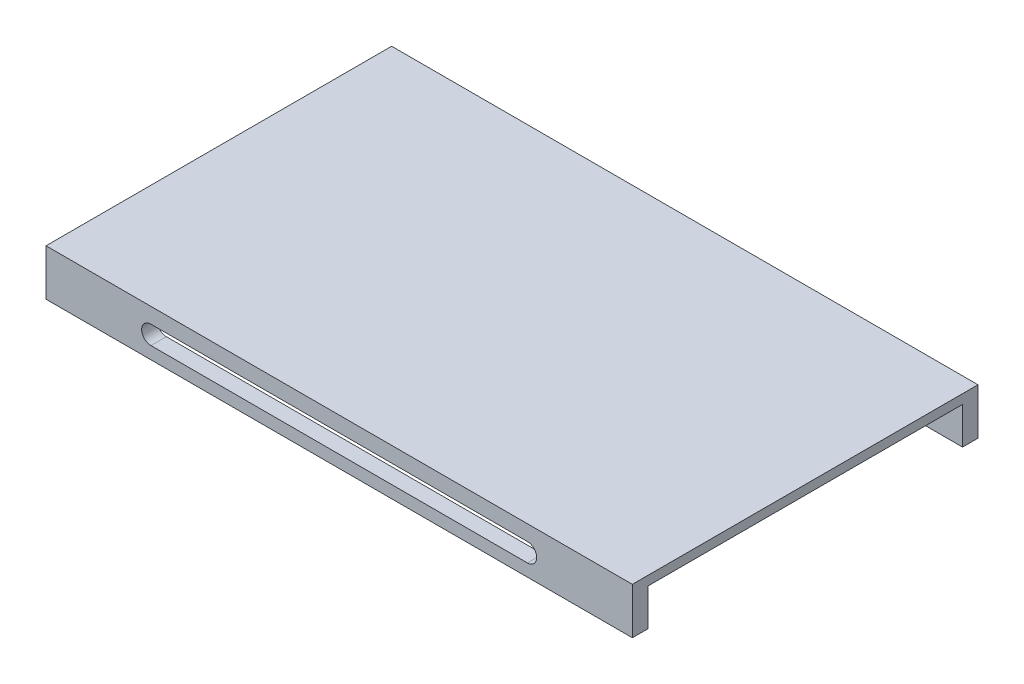
ISO-10303-21;
HEADER;
FILE_DESCRIPTION(('STEP AP214'),'2;1');
FILE_NAME('part.step','',(''),(''),'','','');
FILE_SCHEMA(('AUTOMOTIVE_DESIGN { 1 0 10303 214 1 1 1 1 }'));
ENDSEC;
DATA;
#1=APPLICATION_CONTEXT('core data for automotive mechanical design processes');
#2=APPLICATION_PROTOCOL_DEFINITION('international standard','automotive_design',2000,#1);
#3=PRODUCT_CONTEXT('',#1,'mechanical');
#4=PRODUCT('Part','Part','',(#3));
#5=PRODUCT_RELATED_PRODUCT_CATEGORY('part','',(#4));
#6=PRODUCT_DEFINITION_FORMATION('','',#4);
#7=PRODUCT_DEFINITION_CONTEXT('part definition',#1,'design');
#8=PRODUCT_DEFINITION('design','',#6,#7);
#9=PRODUCT_DEFINITION_SHAPE('','',#8);
#10=(LENGTH_UNIT() NAMED_UNIT(*) SI_UNIT(.MILLI.,.METRE.));
#11=(NAMED_UNIT(*) PLANE_ANGLE_UNIT() SI_UNIT($,.RADIAN.));
#12=(NAMED_UNIT(*) SI_UNIT($,.STERADIAN.) SOLID_ANGLE_UNIT());
#13=UNCERTAINTY_MEASURE_WITH_UNIT(LENGTH_MEASURE(1.E-05),#10,'distance_accuracy_value','');
#14=(GEOMETRIC_REPRESENTATION_CONTEXT(3) GLOBAL_UNCERTAINTY_ASSIGNED_CONTEXT((#13)) GLOBAL_UNIT_ASSIGNED_CONTEXT((#10,
#11,#12)) REPRESENTATION_CONTEXT('',''));
#15=CARTESIAN_POINT('',(0.,0.,0.));
#16=DIRECTION('',(0.,0.,1.));
#17=DIRECTION('',(1.,0.,0.));
#18=AXIS2_PLACEMENT_3D('',#15,#16,#17);
#19=CARTESIAN_POINT('',(0.,0.,0.));
#20=DIRECTION('',(0.,1.,0.));
#21=DIRECTION('',(0.,0.,1.));
#22=AXIS2_PLACEMENT_3D('',#19,#20,#21);
#23=PLANE('',#22);
#24=DIRECTION('',(0.,0.,1.));
#25=VECTOR('',#24,1.);
#26=CARTESIAN_POINT('',(0.,0.,0.));
#27=LINE('',#26,#25);
#28=CARTESIAN_POINT('',(0.,0.,107.));
#29=VERTEX_POINT('',#28);
#30=CARTESIAN_POINT('',(0.,0.,112.));
#31=VERTEX_POINT('',#30);
#32=EDGE_CURVE('E171',#29,#31,#27,.T.);
#33=ORIENTED_EDGE('',*,*,#32,.F.);
#34=DIRECTION('',(1.,0.,0.));
#35=VECTOR('',#34,1.);
#36=CARTESIAN_POINT('',(0.,0.,107.));
#37=LINE('',#36,#35);
#38=CARTESIAN_POINT('',(190.,0.,107.));
#39=VERTEX_POINT('',#38);
#40=EDGE_CURVE('E162',#29,#39,#37,.T.);
#41=ORIENTED_EDGE('',*,*,#40,.T.);
#42=DIRECTION('',(0.,0.,-1.));
#43=VECTOR('',#42,1.);
#44=CARTESIAN_POINT('',(190.,0.,112.));
#45=LINE('',#44,#43);
#46=CARTESIAN_POINT('',(190.,0.,112.));
#47=VERTEX_POINT('',#46);
#48=EDGE_CURVE('E195',#47,#39,#45,.T.);
#49=ORIENTED_EDGE('',*,*,#48,.F.);
#50=DIRECTION('',(1.,0.,0.));
#51=VECTOR('',#50,1.);
#52=CARTESIAN_POINT('',(0.,0.,112.));
#53=LINE('',#52,#51);
#54=EDGE_CURVE('E192',#31,#47,#53,.T.);
#55=ORIENTED_EDGE('',*,*,#54,.F.);
#56=EDGE_LOOP('',(#33,#41,#49,#55));
#57=FACE_BOUND('',#56,.T.);
#58=ADVANCED_FACE('F33',(#57),#23,.F.);
#59=CARTESIAN_POINT('',(0.,15.,0.));
#60=DIRECTION('',(1.,0.,0.));
#61=DIRECTION('',(0.,0.,-1.));
#62=AXIS2_PLACEMENT_3D('',#59,#60,#61);
#63=PLANE('',#62);
#64=DIRECTION('',(0.,0.,1.));
#65=VECTOR('',#64,1.);
#66=CARTESIAN_POINT('',(0.,12.,107.));
#67=LINE('',#66,#65);
#68=CARTESIAN_POINT('',(0.,12.,5.));
#69=VERTEX_POINT('',#68);
#70=CARTESIAN_POINT('',(0.,12.,107.));
#71=VERTEX_POINT('',#70);
#72=EDGE_CURVE('E159',#69,#71,#67,.T.);
#73=ORIENTED_EDGE('',*,*,#72,.T.);
#74=DIRECTION('',(0.,-1.,0.));
#75=VECTOR('',#74,1.);
#76=CARTESIAN_POINT('',(0.,0.,107.));
#77=LINE('',#76,#75);
#78=EDGE_CURVE('E152',#71,#29,#77,.T.);
#79=ORIENTED_EDGE('',*,*,#78,.T.);
#80=ORIENTED_EDGE('',*,*,#32,.T.);
#81=DIRECTION('',(0.,-1.,0.));
#82=VECTOR('',#81,1.);
#83=CARTESIAN_POINT('',(0.,15.,112.));
#84=LINE('',#83,#82);
#85=CARTESIAN_POINT('',(0.,15.,112.));
#86=VERTEX_POINT('',#85);
#87=EDGE_CURVE('E207',#86,#31,#84,.T.);
#88=ORIENTED_EDGE('',*,*,#87,.F.);
#89=DIRECTION('',(0.,0.,1.));
#90=VECTOR('',#89,1.);
#91=CARTESIAN_POINT('',(0.,15.,0.));
#92=LINE('',#91,#90);
#93=CARTESIAN_POINT('',(0.,15.,0.));
#94=VERTEX_POINT('',#93);
#95=EDGE_CURVE('E178',#94,#86,#92,.T.);
#96=ORIENTED_EDGE('',*,*,#95,.F.);
#97=DIRECTION('',(0.,-1.,0.));
#98=VECTOR('',#97,1.);
#99=CARTESIAN_POINT('',(0.,15.,0.));
#100=LINE('',#99,#98);
#101=CARTESIAN_POINT('',(0.,0.,0.));
#102=VERTEX_POINT('',#101);
#103=EDGE_CURVE('E188',#94,#102,#100,.T.);
#104=ORIENTED_EDGE('',*,*,#103,.T.);
#105=CARTESIAN_POINT('',(0.,0.,5.));
#106=VERTEX_POINT('',#105);
#107=EDGE_CURVE('E189',#102,#106,#27,.T.);
#108=ORIENTED_EDGE('',*,*,#107,.T.);
#109=DIRECTION('',(0.,1.,0.));
#110=VECTOR('',#109,1.);
#111=CARTESIAN_POINT('',(0.,12.,5.));
#112=LINE('',#111,#110);
#113=EDGE_CURVE('E155',#106,#69,#112,.T.);
#114=ORIENTED_EDGE('',*,*,#113,.T.);
#115=EDGE_LOOP('',(#73,#79,#80,#88,#96,#104,#108,#114));
#116=FACE_BOUND('',#115,.T.);
#117=ADVANCED_FACE('F35',(#116),#63,.F.);
#118=CARTESIAN_POINT('',(0.,15.,112.));
#119=DIRECTION('',(0.,0.,-1.));
#120=DIRECTION('',(-1.,0.,0.));
#121=AXIS2_PLACEMENT_3D('',#118,#119,#120);
#122=PLANE('',#121);
#123=DIRECTION('',(1.,0.,0.));
#124=VECTOR('',#123,1.);
#125=CARTESIAN_POINT('',(34.,4.,112.));
#126=LINE('',#125,#124);
#127=CARTESIAN_POINT('',(34.,4.,112.));
#128=VERTEX_POINT('',#127);
#129=CARTESIAN_POINT('',(156.,4.,112.));
#130=VERTEX_POINT('',#129);
#131=EDGE_CURVE('E135',#128,#130,#126,.T.);
#132=ORIENTED_EDGE('',*,*,#131,.F.);
#133=CARTESIAN_POINT('',(34.,7.,112.));
#134=DIRECTION('',(0.,0.,1.));
#135=DIRECTION('',(1.,0.,0.));
#136=AXIS2_PLACEMENT_3D('',#133,#134,#135);
#137=CIRCLE('',#136,3.);
#138=CARTESIAN_POINT('',(34.,10.,112.));
#139=VERTEX_POINT('',#138);
#140=EDGE_CURVE('E49',#139,#128,#137,.T.);
#141=ORIENTED_EDGE('',*,*,#140,.F.);
#142=DIRECTION('',(-1.,0.,0.));
#143=VECTOR('',#142,1.);
#144=CARTESIAN_POINT('',(34.,10.,112.));
#145=LINE('',#144,#143);
#146=CARTESIAN_POINT('',(156.,10.,112.));
#147=VERTEX_POINT('',#146);
#148=EDGE_CURVE('E142',#147,#139,#145,.T.);
#149=ORIENTED_EDGE('',*,*,#148,.F.);
#150=CARTESIAN_POINT('',(156.,7.,112.));
#151=DIRECTION('',(0.,0.,1.));
#152=DIRECTION('',(-1.,0.,0.));
#153=AXIS2_PLACEMENT_3D('',#150,#151,#152);
#154=CIRCLE('',#153,3.);
#155=EDGE_CURVE('E126',#130,#147,#154,.T.);
#156=ORIENTED_EDGE('',*,*,#155,.F.);
#157=EDGE_LOOP('',(#132,#141,#149,#156));
#158=FACE_BOUND('',#157,.T.);
#159=ORIENTED_EDGE('',*,*,#54,.T.);
#160=DIRECTION('',(0.,-1.,0.));
#161=VECTOR('',#160,1.);
#162=CARTESIAN_POINT('',(190.,15.,112.));
#163=LINE('',#162,#161);
#164=CARTESIAN_POINT('',(190.,15.,112.));
#165=VERTEX_POINT('',#164);
#166=EDGE_CURVE('E204',#165,#47,#163,.T.);
#167=ORIENTED_EDGE('',*,*,#166,.F.);
#168=DIRECTION('',(1.,0.,0.));
#169=VECTOR('',#168,1.);
#170=CARTESIAN_POINT('',(0.,15.,112.));
#171=LINE('',#170,#169);
#172=EDGE_CURVE('E181',#86,#165,#171,.T.);
#173=ORIENTED_EDGE('',*,*,#172,.F.);
#174=ORIENTED_EDGE('',*,*,#87,.T.);
#175=EDGE_LOOP('',(#159,#167,#173,#174));
#176=FACE_BOUND('',#175,.T.);
#177=ADVANCED_FACE('F139',(#158,#176),#122,.F.);
#178=CARTESIAN_POINT('',(190.,15.,112.));
#179=DIRECTION('',(-1.,0.,0.));
#180=DIRECTION('',(0.,0.,1.));
#181=AXIS2_PLACEMENT_3D('',#178,#179,#180);
#182=PLANE('',#181);
#183=ORIENTED_EDGE('',*,*,#48,.T.);
#184=DIRECTION('',(0.,-1.,0.));
#185=VECTOR('',#184,1.);
#186=CARTESIAN_POINT('',(190.,0.,107.));
#187=LINE('',#186,#185);
#188=CARTESIAN_POINT('',(190.,12.,107.));
#189=VERTEX_POINT('',#188);
#190=EDGE_CURVE('E149',#189,#39,#187,.T.);
#191=ORIENTED_EDGE('',*,*,#190,.F.);
#192=DIRECTION('',(0.,0.,1.));
#193=VECTOR('',#192,1.);
#194=CARTESIAN_POINT('',(190.,12.,107.));
#195=LINE('',#194,#193);
#196=CARTESIAN_POINT('',(190.,12.,5.));
#197=VERTEX_POINT('',#196);
#198=EDGE_CURVE('E156',#197,#189,#195,.T.);
#199=ORIENTED_EDGE('',*,*,#198,.F.);
#200=DIRECTION('',(0.,1.,0.));
#201=VECTOR('',#200,1.);
#202=CARTESIAN_POINT('',(190.,12.,5.));
#203=LINE('',#202,#201);
#204=CARTESIAN_POINT('',(190.,0.,5.));
#205=VERTEX_POINT('',#204);
#206=EDGE_CURVE('E164',#205,#197,#203,.T.);
#207=ORIENTED_EDGE('',*,*,#206,.F.);
#208=CARTESIAN_POINT('',(190.,0.,0.));
#209=VERTEX_POINT('',#208);
#210=EDGE_CURVE('E194',#205,#209,#45,.T.);
#211=ORIENTED_EDGE('',*,*,#210,.T.);
#212=DIRECTION('',(0.,-1.,0.));
#213=VECTOR('',#212,1.);
#214=CARTESIAN_POINT('',(190.,15.,0.));
#215=LINE('',#214,#213);
#216=CARTESIAN_POINT('',(190.,15.,0.));
#217=VERTEX_POINT('',#216);
#218=EDGE_CURVE('E201',#217,#209,#215,.T.);
#219=ORIENTED_EDGE('',*,*,#218,.F.);
#220=DIRECTION('',(0.,0.,-1.));
#221=VECTOR('',#220,1.);
#222=CARTESIAN_POINT('',(190.,15.,112.));
#223=LINE('',#222,#221);
#224=EDGE_CURVE('E184',#165,#217,#223,.T.);
#225=ORIENTED_EDGE('',*,*,#224,.F.);
#226=ORIENTED_EDGE('',*,*,#166,.T.);
#227=EDGE_LOOP('',(#183,#191,#199,#207,#211,#219,#225,#226));
#228=FACE_BOUND('',#227,.T.);
#229=ADVANCED_FACE('F263',(#228),#182,.F.);
#230=CARTESIAN_POINT('',(0.,15.,0.));
#231=DIRECTION('',(0.,0.,1.));
#232=DIRECTION('',(1.,0.,0.));
#233=AXIS2_PLACEMENT_3D('',#230,#231,#232);
#234=PLANE('',#233);
#235=CARTESIAN_POINT('',(95.,7.5,0.));
#236=DIRECTION('',(0.,0.,-1.));
#237=DIRECTION('',(-1.,0.,0.));
#238=AXIS2_PLACEMENT_3D('',#235,#236,#237);
#239=CIRCLE('',#238,3.00000000000001);
#240=CARTESIAN_POINT('',(92.,7.5,0.));
#241=VERTEX_POINT('',#240);
#242=EDGE_CURVE('E371',#241,#241,#239,.T.);
#243=ORIENTED_EDGE('',*,*,#242,.F.);
#244=EDGE_LOOP('',(#243));
#245=FACE_BOUND('',#244,.T.);
#246=DIRECTION('',(-1.,0.,0.));
#247=VECTOR('',#246,1.);
#248=CARTESIAN_POINT('',(0.,0.,0.));
#249=LINE('',#248,#247);
#250=EDGE_CURVE('E182',#209,#102,#249,.T.);
#251=ORIENTED_EDGE('',*,*,#250,.T.);
#252=ORIENTED_EDGE('',*,*,#103,.F.);
#253=DIRECTION('',(-1.,0.,0.));
#254=VECTOR('',#253,1.);
#255=CARTESIAN_POINT('',(0.,15.,0.));
#256=LINE('',#255,#254);
#257=EDGE_CURVE('E186',#217,#94,#256,.T.);
#258=ORIENTED_EDGE('',*,*,#257,.F.);
#259=ORIENTED_EDGE('',*,*,#218,.T.);
#260=EDGE_LOOP('',(#251,#252,#258,#259));
#261=FACE_BOUND('',#260,.T.);
#262=ADVANCED_FACE('F254',(#245,#261),#234,.F.);
#263=CARTESIAN_POINT('',(0.,15.,0.));
#264=DIRECTION('',(0.,1.,0.));
#265=DIRECTION('',(0.,0.,1.));
#266=AXIS2_PLACEMENT_3D('',#263,#264,#265);
#267=PLANE('',#266);
#268=ORIENTED_EDGE('',*,*,#95,.T.);
#269=ORIENTED_EDGE('',*,*,#172,.T.);
#270=ORIENTED_EDGE('',*,*,#224,.T.);
#271=ORIENTED_EDGE('',*,*,#257,.T.);
#272=EDGE_LOOP('',(#268,#269,#270,#271));
#273=FACE_BOUND('',#272,.T.);
#274=ADVANCED_FACE('F247',(#273),#267,.T.);
#275=ORIENTED_EDGE('',*,*,#210,.F.);
#276=DIRECTION('',(1.,0.,0.));
#277=VECTOR('',#276,1.);
#278=CARTESIAN_POINT('',(0.,0.,5.));
#279=LINE('',#278,#277);
#280=EDGE_CURVE('E174',#106,#205,#279,.T.);
#281=ORIENTED_EDGE('',*,*,#280,.F.);
#282=ORIENTED_EDGE('',*,*,#107,.F.);
#283=ORIENTED_EDGE('',*,*,#250,.F.);
#284=EDGE_LOOP('',(#275,#281,#282,#283));
#285=FACE_BOUND('',#284,.T.);
#286=ADVANCED_FACE('F238',(#285),#23,.F.);
#287=CARTESIAN_POINT('',(0.,0.,107.));
#288=DIRECTION('',(0.,0.,1.));
#289=DIRECTION('',(1.,0.,0.));
#290=AXIS2_PLACEMENT_3D('',#287,#288,#289);
#291=PLANE('',#290);
#292=DIRECTION('',(-1.,0.,0.));
#293=VECTOR('',#292,1.);
#294=CARTESIAN_POINT('',(0.,10.,107.));
#295=LINE('',#294,#293);
#296=CARTESIAN_POINT('',(156.,10.,107.));
#297=VERTEX_POINT('',#296);
#298=CARTESIAN_POINT('',(34.,10.,107.));
#299=VERTEX_POINT('',#298);
#300=EDGE_CURVE('E42',#297,#299,#295,.T.);
#301=ORIENTED_EDGE('',*,*,#300,.T.);
#302=CARTESIAN_POINT('',(34.,7.,107.));
#303=DIRECTION('',(0.,0.,1.));
#304=DIRECTION('',(1.,0.,0.));
#305=AXIS2_PLACEMENT_3D('',#302,#303,#304);
#306=CIRCLE('',#305,3.);
#307=CARTESIAN_POINT('',(34.,4.,107.));
#308=VERTEX_POINT('',#307);
#309=EDGE_CURVE('E11',#299,#308,#306,.T.);
#310=ORIENTED_EDGE('',*,*,#309,.T.);
#311=DIRECTION('',(1.,0.,0.));
#312=VECTOR('',#311,1.);
#313=CARTESIAN_POINT('',(0.,4.,107.));
#314=LINE('',#313,#312);
#315=CARTESIAN_POINT('',(156.,4.,107.));
#316=VERTEX_POINT('',#315);
#317=EDGE_CURVE('E210',#308,#316,#314,.T.);
#318=ORIENTED_EDGE('',*,*,#317,.T.);
#319=CARTESIAN_POINT('',(156.,7.,107.));
#320=DIRECTION('',(0.,0.,1.));
#321=DIRECTION('',(1.,0.,0.));
#322=AXIS2_PLACEMENT_3D('',#319,#320,#321);
#323=CIRCLE('',#322,3.);
#324=EDGE_CURVE('E129',#316,#297,#323,.T.);
#325=ORIENTED_EDGE('',*,*,#324,.T.);
#326=EDGE_LOOP('',(#301,#310,#318,#325));
#327=FACE_BOUND('',#326,.T.);
#328=ORIENTED_EDGE('',*,*,#190,.T.);
#329=ORIENTED_EDGE('',*,*,#40,.F.);
#330=ORIENTED_EDGE('',*,*,#78,.F.);
#331=DIRECTION('',(1.,0.,0.));
#332=VECTOR('',#331,1.);
#333=CARTESIAN_POINT('',(0.,12.,107.));
#334=LINE('',#333,#332);
#335=EDGE_CURVE('E169',#71,#189,#334,.T.);
#336=ORIENTED_EDGE('',*,*,#335,.T.);
#337=EDGE_LOOP('',(#328,#329,#330,#336));
#338=FACE_BOUND('',#337,.T.);
#339=ADVANCED_FACE('F215',(#327,#338),#291,.F.);
#340=CARTESIAN_POINT('',(0.,12.,107.));
#341=DIRECTION('',(0.,1.,0.));
#342=DIRECTION('',(0.,0.,1.));
#343=AXIS2_PLACEMENT_3D('',#340,#341,#342);
#344=PLANE('',#343);
#345=ORIENTED_EDGE('',*,*,#198,.T.);
#346=ORIENTED_EDGE('',*,*,#335,.F.);
#347=ORIENTED_EDGE('',*,*,#72,.F.);
#348=DIRECTION('',(1.,0.,0.));
#349=VECTOR('',#348,1.);
#350=CARTESIAN_POINT('',(0.,12.,5.));
#351=LINE('',#350,#349);
#352=EDGE_CURVE('E172',#69,#197,#351,.T.);
#353=ORIENTED_EDGE('',*,*,#352,.T.);
#354=EDGE_LOOP('',(#345,#346,#347,#353));
#355=FACE_BOUND('',#354,.T.);
#356=ADVANCED_FACE('F230',(#355),#344,.F.);
#357=CARTESIAN_POINT('',(0.,12.,5.));
#358=DIRECTION('',(0.,0.,-1.));
#359=DIRECTION('',(0.,1.,0.));
#360=AXIS2_PLACEMENT_3D('',#357,#358,#359);
#361=PLANE('',#360);
#362=CARTESIAN_POINT('',(95.,7.5,5.));
#363=DIRECTION('',(0.,0.,-1.));
#364=DIRECTION('',(0.,1.,0.));
#365=AXIS2_PLACEMENT_3D('',#362,#363,#364);
#366=CIRCLE('',#365,3.00000000000001);
#367=CARTESIAN_POINT('',(95.,10.5,5.));
#368=VERTEX_POINT('',#367);
#369=EDGE_CURVE('E37',#368,#368,#366,.T.);
#370=ORIENTED_EDGE('',*,*,#369,.T.);
#371=EDGE_LOOP('',(#370));
#372=FACE_BOUND('',#371,.T.);
#373=ORIENTED_EDGE('',*,*,#206,.T.);
#374=ORIENTED_EDGE('',*,*,#352,.F.);
#375=ORIENTED_EDGE('',*,*,#113,.F.);
#376=ORIENTED_EDGE('',*,*,#280,.T.);
#377=EDGE_LOOP('',(#373,#374,#375,#376));
#378=FACE_BOUND('',#377,.T.);
#379=ADVANCED_FACE('F222',(#372,#378),#361,.F.);
#380=CARTESIAN_POINT('',(34.,7.,102.));
#381=DIRECTION('',(0.,0.,1.));
#382=DIRECTION('',(1.,0.,0.));
#383=AXIS2_PLACEMENT_3D('',#380,#381,#382);
#384=CYLINDRICAL_SURFACE('',#383,3.);
#385=DIRECTION('',(0.,0.,1.));
#386=VECTOR('',#385,1.);
#387=CARTESIAN_POINT('',(34.,10.,102.));
#388=LINE('',#387,#386);
#389=EDGE_CURVE('E147',#299,#139,#388,.T.);
#390=ORIENTED_EDGE('',*,*,#389,.T.);
#391=ORIENTED_EDGE('',*,*,#140,.T.);
#392=DIRECTION('',(0.,0.,1.));
#393=VECTOR('',#392,1.);
#394=CARTESIAN_POINT('',(34.,4.,102.));
#395=LINE('',#394,#393);
#396=EDGE_CURVE('E132',#308,#128,#395,.T.);
#397=ORIENTED_EDGE('',*,*,#396,.F.);
#398=ORIENTED_EDGE('',*,*,#309,.F.);
#399=EDGE_LOOP('',(#390,#391,#397,#398));
#400=FACE_BOUND('',#399,.T.);
#401=ADVANCED_FACE('F220',(#400),#384,.F.);
#402=CARTESIAN_POINT('',(34.,10.,102.));
#403=DIRECTION('',(0.,1.,0.));
#404=DIRECTION('',(0.,0.,1.));
#405=AXIS2_PLACEMENT_3D('',#402,#403,#404);
#406=PLANE('',#405);
#407=DIRECTION('',(0.,0.,1.));
#408=VECTOR('',#407,1.);
#409=CARTESIAN_POINT('',(156.,10.,102.));
#410=LINE('',#409,#408);
#411=EDGE_CURVE('E131',#297,#147,#410,.T.);
#412=ORIENTED_EDGE('',*,*,#411,.T.);
#413=ORIENTED_EDGE('',*,*,#148,.T.);
#414=ORIENTED_EDGE('',*,*,#389,.F.);
#415=ORIENTED_EDGE('',*,*,#300,.F.);
#416=EDGE_LOOP('',(#412,#413,#414,#415));
#417=FACE_BOUND('',#416,.T.);
#418=ADVANCED_FACE('F219',(#417),#406,.F.);
#419=CARTESIAN_POINT('',(156.,7.,102.));
#420=DIRECTION('',(0.,0.,1.));
#421=DIRECTION('',(1.,0.,0.));
#422=AXIS2_PLACEMENT_3D('',#419,#420,#421);
#423=CYLINDRICAL_SURFACE('',#422,3.);
#424=DIRECTION('',(0.,0.,1.));
#425=VECTOR('',#424,1.);
#426=CARTESIAN_POINT('',(156.,4.,102.));
#427=LINE('',#426,#425);
#428=EDGE_CURVE('E57',#316,#130,#427,.T.);
#429=ORIENTED_EDGE('',*,*,#428,.T.);
#430=ORIENTED_EDGE('',*,*,#155,.T.);
#431=ORIENTED_EDGE('',*,*,#411,.F.);
#432=ORIENTED_EDGE('',*,*,#324,.F.);
#433=EDGE_LOOP('',(#429,#430,#431,#432));
#434=FACE_BOUND('',#433,.T.);
#435=ADVANCED_FACE('F123',(#434),#423,.F.);
#436=CARTESIAN_POINT('',(34.,4.,102.));
#437=DIRECTION('',(0.,-1.,0.));
#438=DIRECTION('',(0.,0.,-1.));
#439=AXIS2_PLACEMENT_3D('',#436,#437,#438);
#440=PLANE('',#439);
#441=ORIENTED_EDGE('',*,*,#396,.T.);
#442=ORIENTED_EDGE('',*,*,#131,.T.);
#443=ORIENTED_EDGE('',*,*,#428,.F.);
#444=ORIENTED_EDGE('',*,*,#317,.F.);
#445=EDGE_LOOP('',(#441,#442,#443,#444));
#446=FACE_BOUND('',#445,.T.);
#447=ADVANCED_FACE('F136',(#446),#440,.F.);
#448=CARTESIAN_POINT('',(95.,7.5,10.));
#449=DIRECTION('',(0.,0.,-1.));
#450=DIRECTION('',(-1.,0.,0.));
#451=AXIS2_PLACEMENT_3D('',#448,#449,#450);
#452=CYLINDRICAL_SURFACE('',#451,3.00000000000001);
#453=ORIENTED_EDGE('',*,*,#242,.T.);
#454=EDGE_LOOP('',(#453));
#455=FACE_BOUND('',#454,.T.);
#456=ORIENTED_EDGE('',*,*,#369,.F.);
#457=EDGE_LOOP('',(#456));
#458=FACE_BOUND('',#457,.T.);
#459=ADVANCED_FACE('F298',(#455,#458),#452,.F.);
#460=CLOSED_SHELL('',(#58,#117,#177,#229,#262,#274,#286,#339,#356,#379,#401,#418,#435,#447,#459));
#461=MANIFOLD_SOLID_BREP('B2',#460);
#462=ADVANCED_BREP_SHAPE_REPRESENTATION('',(#18,#461),#14);
#463=SHAPE_DEFINITION_REPRESENTATION(#9,#462);
ENDSEC;
END-ISO-10303-21;
